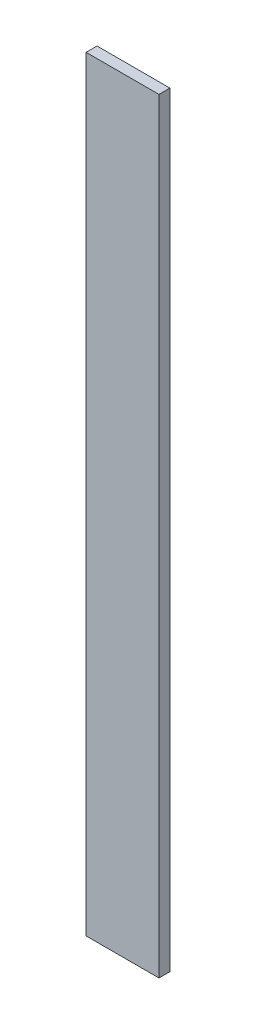
ISO-10303-21;
HEADER;
FILE_DESCRIPTION(('STEP AP214'),'2;1');
FILE_NAME('part.step','',(''),(''),'','','');
FILE_SCHEMA(('AUTOMOTIVE_DESIGN { 1 0 10303 214 1 1 1 1 }'));
ENDSEC;
DATA;
#1=APPLICATION_CONTEXT('core data for automotive mechanical design processes');
#2=APPLICATION_PROTOCOL_DEFINITION('international standard','automotive_design',2000,#1);
#3=PRODUCT_CONTEXT('',#1,'mechanical');
#4=PRODUCT('Part','Part','',(#3));
#5=PRODUCT_RELATED_PRODUCT_CATEGORY('part','',(#4));
#6=PRODUCT_DEFINITION_FORMATION('','',#4);
#7=PRODUCT_DEFINITION_CONTEXT('part definition',#1,'design');
#8=PRODUCT_DEFINITION('design','',#6,#7);
#9=PRODUCT_DEFINITION_SHAPE('','',#8);
#10=(LENGTH_UNIT() NAMED_UNIT(*) SI_UNIT(.MILLI.,.METRE.));
#11=(NAMED_UNIT(*) PLANE_ANGLE_UNIT() SI_UNIT($,.RADIAN.));
#12=(NAMED_UNIT(*) SI_UNIT($,.STERADIAN.) SOLID_ANGLE_UNIT());
#13=UNCERTAINTY_MEASURE_WITH_UNIT(LENGTH_MEASURE(1.E-05),#10,'distance_accuracy_value','');
#14=(GEOMETRIC_REPRESENTATION_CONTEXT(3) GLOBAL_UNCERTAINTY_ASSIGNED_CONTEXT((#13)) GLOBAL_UNIT_ASSIGNED_CONTEXT((#10,
#11,#12)) REPRESENTATION_CONTEXT('',''));
#15=CARTESIAN_POINT('',(0.,0.,0.));
#16=DIRECTION('',(0.,0.,1.));
#17=DIRECTION('',(1.,0.,0.));
#18=AXIS2_PLACEMENT_3D('',#15,#16,#17);
#19=CARTESIAN_POINT('',(20.,-210.,6.));
#20=DIRECTION('',(-1.,0.,0.));
#21=DIRECTION('',(0.,0.,1.));
#22=AXIS2_PLACEMENT_3D('',#19,#20,#21);
#23=PLANE('',#22);
#24=DIRECTION('',(0.,1.,0.));
#25=VECTOR('',#24,1.);
#26=CARTESIAN_POINT('',(20.,-210.,0.));
#27=LINE('',#26,#25);
#28=CARTESIAN_POINT('',(20.,-210.,0.));
#29=VERTEX_POINT('',#28);
#30=CARTESIAN_POINT('',(20.,210.,0.));
#31=VERTEX_POINT('',#30);
#32=EDGE_CURVE('E96',#29,#31,#27,.T.);
#33=ORIENTED_EDGE('',*,*,#32,.T.);
#34=DIRECTION('',(0.,0.,-1.));
#35=VECTOR('',#34,1.);
#36=CARTESIAN_POINT('',(20.,210.,6.));
#37=LINE('',#36,#35);
#38=CARTESIAN_POINT('',(20.,210.,6.));
#39=VERTEX_POINT('',#38);
#40=EDGE_CURVE('E11',#39,#31,#37,.T.);
#41=ORIENTED_EDGE('',*,*,#40,.F.);
#42=DIRECTION('',(0.,1.,0.));
#43=VECTOR('',#42,1.);
#44=CARTESIAN_POINT('',(20.,-210.,6.));
#45=LINE('',#44,#43);
#46=CARTESIAN_POINT('',(20.,-210.,6.));
#47=VERTEX_POINT('',#46);
#48=EDGE_CURVE('E84',#47,#39,#45,.T.);
#49=ORIENTED_EDGE('',*,*,#48,.F.);
#50=DIRECTION('',(0.,0.,-1.));
#51=VECTOR('',#50,1.);
#52=CARTESIAN_POINT('',(20.,-210.,6.));
#53=LINE('',#52,#51);
#54=EDGE_CURVE('E92',#47,#29,#53,.T.);
#55=ORIENTED_EDGE('',*,*,#54,.T.);
#56=EDGE_LOOP('',(#33,#41,#49,#55));
#57=FACE_BOUND('',#56,.T.);
#58=ADVANCED_FACE('F33',(#57),#23,.F.);
#59=CARTESIAN_POINT('',(-20.,210.,6.));
#60=DIRECTION('',(0.,-1.,0.));
#61=DIRECTION('',(0.,0.,-1.));
#62=AXIS2_PLACEMENT_3D('',#59,#60,#61);
#63=PLANE('',#62);
#64=DIRECTION('',(-1.,0.,0.));
#65=VECTOR('',#64,1.);
#66=CARTESIAN_POINT('',(-20.,210.,0.));
#67=LINE('',#66,#65);
#68=CARTESIAN_POINT('',(-20.,210.,0.));
#69=VERTEX_POINT('',#68);
#70=EDGE_CURVE('E88',#31,#69,#67,.T.);
#71=ORIENTED_EDGE('',*,*,#70,.T.);
#72=DIRECTION('',(0.,0.,-1.));
#73=VECTOR('',#72,1.);
#74=CARTESIAN_POINT('',(-20.,210.,6.));
#75=LINE('',#74,#73);
#76=CARTESIAN_POINT('',(-20.,210.,6.));
#77=VERTEX_POINT('',#76);
#78=EDGE_CURVE('E41',#77,#69,#75,.T.);
#79=ORIENTED_EDGE('',*,*,#78,.F.);
#80=DIRECTION('',(-1.,0.,0.));
#81=VECTOR('',#80,1.);
#82=CARTESIAN_POINT('',(-20.,210.,6.));
#83=LINE('',#82,#81);
#84=EDGE_CURVE('E79',#39,#77,#83,.T.);
#85=ORIENTED_EDGE('',*,*,#84,.F.);
#86=ORIENTED_EDGE('',*,*,#40,.T.);
#87=EDGE_LOOP('',(#71,#79,#85,#86));
#88=FACE_BOUND('',#87,.T.);
#89=ADVANCED_FACE('F87',(#88),#63,.F.);
#90=CARTESIAN_POINT('',(-20.,-210.,6.));
#91=DIRECTION('',(1.,0.,0.));
#92=DIRECTION('',(0.,0.,-1.));
#93=AXIS2_PLACEMENT_3D('',#90,#91,#92);
#94=PLANE('',#93);
#95=DIRECTION('',(0.,-1.,0.));
#96=VECTOR('',#95,1.);
#97=CARTESIAN_POINT('',(-20.,-210.,0.));
#98=LINE('',#97,#96);
#99=CARTESIAN_POINT('',(-20.,-210.,0.));
#100=VERTEX_POINT('',#99);
#101=EDGE_CURVE('E66',#69,#100,#98,.T.);
#102=ORIENTED_EDGE('',*,*,#101,.T.);
#103=DIRECTION('',(0.,0.,-1.));
#104=VECTOR('',#103,1.);
#105=CARTESIAN_POINT('',(-20.,-210.,6.));
#106=LINE('',#105,#104);
#107=CARTESIAN_POINT('',(-20.,-210.,6.));
#108=VERTEX_POINT('',#107);
#109=EDGE_CURVE('E89',#108,#100,#106,.T.);
#110=ORIENTED_EDGE('',*,*,#109,.F.);
#111=DIRECTION('',(0.,-1.,0.));
#112=VECTOR('',#111,1.);
#113=CARTESIAN_POINT('',(-20.,-210.,6.));
#114=LINE('',#113,#112);
#115=EDGE_CURVE('E82',#77,#108,#114,.T.);
#116=ORIENTED_EDGE('',*,*,#115,.F.);
#117=ORIENTED_EDGE('',*,*,#78,.T.);
#118=EDGE_LOOP('',(#102,#110,#116,#117));
#119=FACE_BOUND('',#118,.T.);
#120=ADVANCED_FACE('F90',(#119),#94,.F.);
#121=CARTESIAN_POINT('',(-20.,-210.,6.));
#122=DIRECTION('',(0.,1.,0.));
#123=DIRECTION('',(0.,0.,1.));
#124=AXIS2_PLACEMENT_3D('',#121,#122,#123);
#125=PLANE('',#124);
#126=DIRECTION('',(1.,0.,0.));
#127=VECTOR('',#126,1.);
#128=CARTESIAN_POINT('',(-20.,-210.,0.));
#129=LINE('',#128,#127);
#130=EDGE_CURVE('E72',#100,#29,#129,.T.);
#131=ORIENTED_EDGE('',*,*,#130,.T.);
#132=ORIENTED_EDGE('',*,*,#54,.F.);
#133=DIRECTION('',(1.,0.,0.));
#134=VECTOR('',#133,1.);
#135=CARTESIAN_POINT('',(-20.,-210.,6.));
#136=LINE('',#135,#134);
#137=EDGE_CURVE('E49',#108,#47,#136,.T.);
#138=ORIENTED_EDGE('',*,*,#137,.F.);
#139=ORIENTED_EDGE('',*,*,#109,.T.);
#140=EDGE_LOOP('',(#131,#132,#138,#139));
#141=FACE_BOUND('',#140,.T.);
#142=ADVANCED_FACE('F103',(#141),#125,.F.);
#143=CARTESIAN_POINT('',(0.,0.,6.));
#144=DIRECTION('',(0.,0.,-1.));
#145=DIRECTION('',(-1.,0.,0.));
#146=AXIS2_PLACEMENT_3D('',#143,#144,#145);
#147=PLANE('',#146);
#148=ORIENTED_EDGE('',*,*,#48,.T.);
#149=ORIENTED_EDGE('',*,*,#84,.T.);
#150=ORIENTED_EDGE('',*,*,#115,.T.);
#151=ORIENTED_EDGE('',*,*,#137,.T.);
#152=EDGE_LOOP('',(#148,#149,#150,#151));
#153=FACE_BOUND('',#152,.T.);
#154=ADVANCED_FACE('F80',(#153),#147,.F.);
#155=CARTESIAN_POINT('',(0.,0.,0.));
#156=DIRECTION('',(0.,0.,-1.));
#157=DIRECTION('',(-1.,0.,0.));
#158=AXIS2_PLACEMENT_3D('',#155,#156,#157);
#159=PLANE('',#158);
#160=ORIENTED_EDGE('',*,*,#32,.F.);
#161=ORIENTED_EDGE('',*,*,#130,.F.);
#162=ORIENTED_EDGE('',*,*,#101,.F.);
#163=ORIENTED_EDGE('',*,*,#70,.F.);
#164=EDGE_LOOP('',(#160,#161,#162,#163));
#165=FACE_BOUND('',#164,.T.);
#166=ADVANCED_FACE('F106',(#165),#159,.T.);
#167=CLOSED_SHELL('',(#58,#89,#120,#142,#154,#166));
#168=MANIFOLD_SOLID_BREP('B2',#167);
#169=ADVANCED_BREP_SHAPE_REPRESENTATION('',(#18,#168),#14);
#170=SHAPE_DEFINITION_REPRESENTATION(#9,#169);
ENDSEC;
END-ISO-10303-21;
